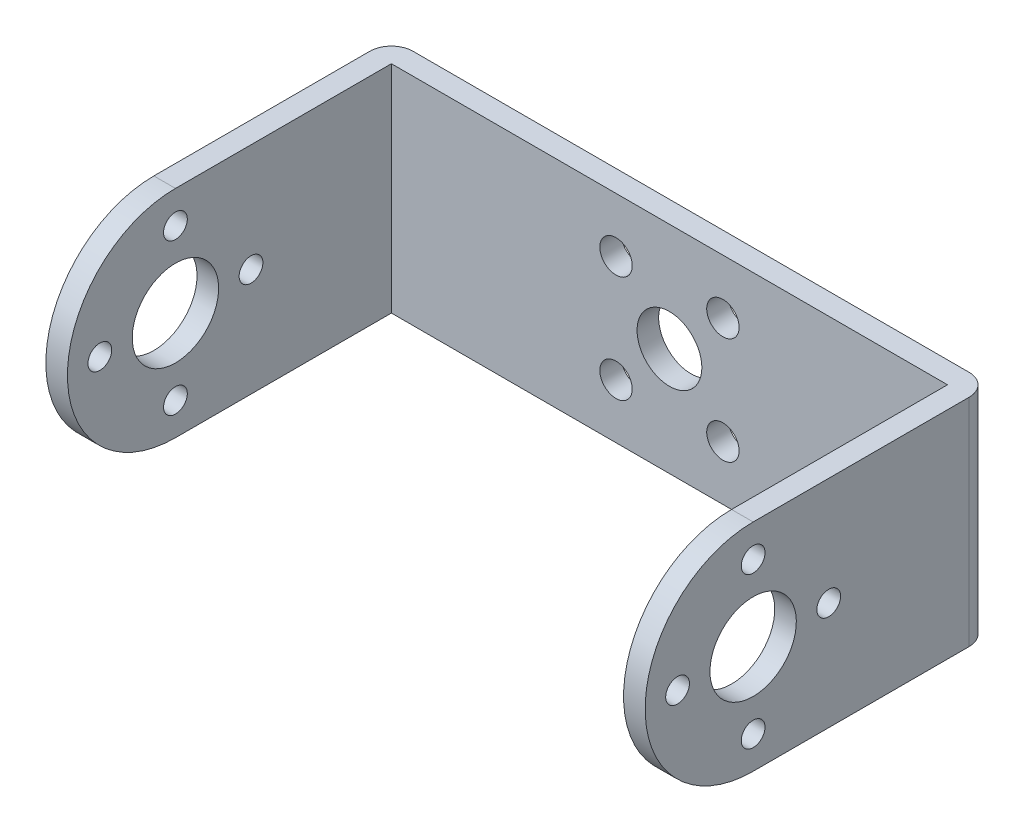
ISO-10303-21;
HEADER;
FILE_DESCRIPTION(('STEP AP214'),'2;1');
FILE_NAME('part.step','',(''),(''),'','','');
FILE_SCHEMA(('AUTOMOTIVE_DESIGN { 1 0 10303 214 1 1 1 1 }'));
ENDSEC;
DATA;
#1=APPLICATION_CONTEXT('core data for automotive mechanical design processes');
#2=APPLICATION_PROTOCOL_DEFINITION('international standard','automotive_design',2000,#1);
#3=PRODUCT_CONTEXT('',#1,'mechanical');
#4=PRODUCT('Part','Part','',(#3));
#5=PRODUCT_RELATED_PRODUCT_CATEGORY('part','',(#4));
#6=PRODUCT_DEFINITION_FORMATION('','',#4);
#7=PRODUCT_DEFINITION_CONTEXT('part definition',#1,'design');
#8=PRODUCT_DEFINITION('design','',#6,#7);
#9=PRODUCT_DEFINITION_SHAPE('','',#8);
#10=(LENGTH_UNIT() NAMED_UNIT(*) SI_UNIT(.MILLI.,.METRE.));
#11=(NAMED_UNIT(*) PLANE_ANGLE_UNIT() SI_UNIT($,.RADIAN.));
#12=(NAMED_UNIT(*) SI_UNIT($,.STERADIAN.) SOLID_ANGLE_UNIT());
#13=UNCERTAINTY_MEASURE_WITH_UNIT(LENGTH_MEASURE(1.E-05),#10,'distance_accuracy_value','');
#14=(GEOMETRIC_REPRESENTATION_CONTEXT(3) GLOBAL_UNCERTAINTY_ASSIGNED_CONTEXT((#13)) GLOBAL_UNIT_ASSIGNED_CONTEXT((#10,
#11,#12)) REPRESENTATION_CONTEXT('',''));
#15=CARTESIAN_POINT('',(0.,0.,0.));
#16=DIRECTION('',(0.,0.,1.));
#17=DIRECTION('',(1.,0.,0.));
#18=AXIS2_PLACEMENT_3D('',#15,#16,#17);
#19=CARTESIAN_POINT('',(0.,0.,2.));
#20=DIRECTION('',(0.,0.,1.));
#21=DIRECTION('',(1.,0.,0.));
#22=AXIS2_PLACEMENT_3D('',#19,#20,#21);
#23=PLANE('',#22);
#24=CARTESIAN_POINT('',(4.94974746830584,-4.94974746830583,2.));
#25=DIRECTION('',(0.,0.,1.));
#26=DIRECTION('',(1.,0.,0.));
#27=AXIS2_PLACEMENT_3D('',#24,#25,#26);
#28=CIRCLE('',#27,1.5);
#29=CARTESIAN_POINT('',(6.44974746830584,-4.94974746830583,2.));
#30=VERTEX_POINT('',#29);
#31=EDGE_CURVE('E278',#30,#30,#28,.T.);
#32=ORIENTED_EDGE('',*,*,#31,.F.);
#33=EDGE_LOOP('',(#32));
#34=FACE_BOUND('',#33,.T.);
#35=CARTESIAN_POINT('',(-4.94974746830583,4.94974746830583,2.));
#36=DIRECTION('',(0.,0.,1.));
#37=DIRECTION('',(1.,0.,0.));
#38=AXIS2_PLACEMENT_3D('',#35,#36,#37);
#39=CIRCLE('',#38,1.5);
#40=CARTESIAN_POINT('',(-3.44974746830583,4.94974746830583,2.));
#41=VERTEX_POINT('',#40);
#42=EDGE_CURVE('E290',#41,#41,#39,.T.);
#43=ORIENTED_EDGE('',*,*,#42,.F.);
#44=EDGE_LOOP('',(#43));
#45=FACE_BOUND('',#44,.T.);
#46=CARTESIAN_POINT('',(0.,0.,2.));
#47=DIRECTION('',(0.,0.,1.));
#48=DIRECTION('',(1.,0.,0.));
#49=AXIS2_PLACEMENT_3D('',#46,#47,#48);
#50=CIRCLE('',#49,3.);
#51=CARTESIAN_POINT('',(3.,0.,2.));
#52=VERTEX_POINT('',#51);
#53=EDGE_CURVE('E218',#52,#52,#50,.T.);
#54=ORIENTED_EDGE('',*,*,#53,.F.);
#55=EDGE_LOOP('',(#54));
#56=FACE_BOUND('',#55,.T.);
#57=CARTESIAN_POINT('',(4.94974746830583,4.94974746830583,2.));
#58=DIRECTION('',(0.,0.,1.));
#59=DIRECTION('',(1.,0.,0.));
#60=AXIS2_PLACEMENT_3D('',#57,#58,#59);
#61=CIRCLE('',#60,1.5);
#62=CARTESIAN_POINT('',(6.44974746830583,4.94974746830583,2.));
#63=VERTEX_POINT('',#62);
#64=EDGE_CURVE('E284',#63,#63,#61,.T.);
#65=ORIENTED_EDGE('',*,*,#64,.F.);
#66=EDGE_LOOP('',(#65));
#67=FACE_BOUND('',#66,.T.);
#68=CARTESIAN_POINT('',(-4.94974746830583,-4.94974746830584,2.));
#69=DIRECTION('',(0.,0.,1.));
#70=DIRECTION('',(1.,0.,0.));
#71=AXIS2_PLACEMENT_3D('',#68,#69,#70);
#72=CIRCLE('',#71,1.5);
#73=CARTESIAN_POINT('',(-3.44974746830583,-4.94974746830584,2.));
#74=VERTEX_POINT('',#73);
#75=EDGE_CURVE('E271',#74,#74,#72,.T.);
#76=ORIENTED_EDGE('',*,*,#75,.F.);
#77=EDGE_LOOP('',(#76));
#78=FACE_BOUND('',#77,.T.);
#79=DIRECTION('',(1.,0.,0.));
#80=VECTOR('',#79,1.);
#81=CARTESIAN_POINT('',(-27.75,-10.,2.));
#82=LINE('',#81,#80);
#83=CARTESIAN_POINT('',(-25.75,-10.,2.));
#84=VERTEX_POINT('',#83);
#85=CARTESIAN_POINT('',(25.75,-10.,2.));
#86=VERTEX_POINT('',#85);
#87=EDGE_CURVE('E195',#84,#86,#82,.T.);
#88=ORIENTED_EDGE('',*,*,#87,.T.);
#89=DIRECTION('',(0.,-1.,0.));
#90=VECTOR('',#89,1.);
#91=CARTESIAN_POINT('',(25.75,10.,2.));
#92=LINE('',#91,#90);
#93=CARTESIAN_POINT('',(25.75,10.,2.));
#94=VERTEX_POINT('',#93);
#95=EDGE_CURVE('E137',#94,#86,#92,.T.);
#96=ORIENTED_EDGE('',*,*,#95,.F.);
#97=DIRECTION('',(-1.,0.,0.));
#98=VECTOR('',#97,1.);
#99=CARTESIAN_POINT('',(-27.75,10.,2.));
#100=LINE('',#99,#98);
#101=CARTESIAN_POINT('',(-25.75,10.,2.));
#102=VERTEX_POINT('',#101);
#103=EDGE_CURVE('E142',#94,#102,#100,.T.);
#104=ORIENTED_EDGE('',*,*,#103,.T.);
#105=DIRECTION('',(0.,-1.,0.));
#106=VECTOR('',#105,1.);
#107=CARTESIAN_POINT('',(-25.75,10.,2.));
#108=LINE('',#107,#106);
#109=EDGE_CURVE('E189',#102,#84,#108,.T.);
#110=ORIENTED_EDGE('',*,*,#109,.T.);
#111=EDGE_LOOP('',(#88,#96,#104,#110));
#112=FACE_BOUND('',#111,.T.);
#113=ADVANCED_FACE('F36',(#34,#45,#56,#67,#78,#112),#23,.T.);
#114=CARTESIAN_POINT('',(0.,0.,0.));
#115=DIRECTION('',(0.,0.,1.));
#116=DIRECTION('',(1.,0.,0.));
#117=AXIS2_PLACEMENT_3D('',#114,#115,#116);
#118=PLANE('',#117);
#119=CARTESIAN_POINT('',(4.94974746830584,-4.94974746830583,0.));
#120=DIRECTION('',(0.,0.,1.));
#121=DIRECTION('',(1.,0.,0.));
#122=AXIS2_PLACEMENT_3D('',#119,#120,#121);
#123=CIRCLE('',#122,1.5);
#124=CARTESIAN_POINT('',(6.44974746830584,-4.94974746830583,0.));
#125=VERTEX_POINT('',#124);
#126=EDGE_CURVE('E276',#125,#125,#123,.T.);
#127=ORIENTED_EDGE('',*,*,#126,.T.);
#128=EDGE_LOOP('',(#127));
#129=FACE_BOUND('',#128,.T.);
#130=CARTESIAN_POINT('',(-4.94974746830583,4.94974746830583,0.));
#131=DIRECTION('',(0.,0.,1.));
#132=DIRECTION('',(1.,0.,0.));
#133=AXIS2_PLACEMENT_3D('',#130,#131,#132);
#134=CIRCLE('',#133,1.5);
#135=CARTESIAN_POINT('',(-3.44974746830583,4.94974746830583,0.));
#136=VERTEX_POINT('',#135);
#137=EDGE_CURVE('E287',#136,#136,#134,.T.);
#138=ORIENTED_EDGE('',*,*,#137,.T.);
#139=EDGE_LOOP('',(#138));
#140=FACE_BOUND('',#139,.T.);
#141=DIRECTION('',(1.,0.,0.));
#142=VECTOR('',#141,1.);
#143=CARTESIAN_POINT('',(-27.75,-10.,0.));
#144=LINE('',#143,#142);
#145=CARTESIAN_POINT('',(-25.75,-10.,0.));
#146=VERTEX_POINT('',#145);
#147=CARTESIAN_POINT('',(25.75,-10.,0.));
#148=VERTEX_POINT('',#147);
#149=EDGE_CURVE('E207',#146,#148,#144,.T.);
#150=ORIENTED_EDGE('',*,*,#149,.F.);
#151=DIRECTION('',(0.,-1.,0.));
#152=VECTOR('',#151,1.);
#153=CARTESIAN_POINT('',(-25.75,0.,0.));
#154=LINE('',#153,#152);
#155=CARTESIAN_POINT('',(-25.75,10.,0.));
#156=VERTEX_POINT('',#155);
#157=EDGE_CURVE('E58',#146,#156,#154,.F.);
#158=ORIENTED_EDGE('',*,*,#157,.T.);
#159=DIRECTION('',(-1.,0.,0.));
#160=VECTOR('',#159,1.);
#161=CARTESIAN_POINT('',(-27.75,10.,0.));
#162=LINE('',#161,#160);
#163=CARTESIAN_POINT('',(25.75,10.,0.));
#164=VERTEX_POINT('',#163);
#165=EDGE_CURVE('E216',#164,#156,#162,.T.);
#166=ORIENTED_EDGE('',*,*,#165,.F.);
#167=DIRECTION('',(0.,1.,0.));
#168=VECTOR('',#167,1.);
#169=CARTESIAN_POINT('',(25.75,0.,0.));
#170=LINE('',#169,#168);
#171=EDGE_CURVE('E237',#164,#148,#170,.F.);
#172=ORIENTED_EDGE('',*,*,#171,.T.);
#173=EDGE_LOOP('',(#150,#158,#166,#172));
#174=FACE_BOUND('',#173,.T.);
#175=CARTESIAN_POINT('',(0.,0.,0.));
#176=DIRECTION('',(0.,0.,1.));
#177=DIRECTION('',(1.,0.,0.));
#178=AXIS2_PLACEMENT_3D('',#175,#176,#177);
#179=CIRCLE('',#178,3.);
#180=CARTESIAN_POINT('',(3.,0.,0.));
#181=VERTEX_POINT('',#180);
#182=EDGE_CURVE('E212',#181,#181,#179,.T.);
#183=ORIENTED_EDGE('',*,*,#182,.T.);
#184=EDGE_LOOP('',(#183));
#185=FACE_BOUND('',#184,.T.);
#186=CARTESIAN_POINT('',(4.94974746830583,4.94974746830583,0.));
#187=DIRECTION('',(0.,0.,1.));
#188=DIRECTION('',(1.,0.,0.));
#189=AXIS2_PLACEMENT_3D('',#186,#187,#188);
#190=CIRCLE('',#189,1.5);
#191=CARTESIAN_POINT('',(6.44974746830583,4.94974746830583,0.));
#192=VERTEX_POINT('',#191);
#193=EDGE_CURVE('E281',#192,#192,#190,.T.);
#194=ORIENTED_EDGE('',*,*,#193,.T.);
#195=EDGE_LOOP('',(#194));
#196=FACE_BOUND('',#195,.T.);
#197=CARTESIAN_POINT('',(-4.94974746830583,-4.94974746830584,0.));
#198=DIRECTION('',(0.,0.,1.));
#199=DIRECTION('',(1.,0.,0.));
#200=AXIS2_PLACEMENT_3D('',#197,#198,#199);
#201=CIRCLE('',#200,1.5);
#202=CARTESIAN_POINT('',(-3.44974746830583,-4.94974746830584,0.));
#203=VERTEX_POINT('',#202);
#204=EDGE_CURVE('E267',#203,#203,#201,.T.);
#205=ORIENTED_EDGE('',*,*,#204,.T.);
#206=EDGE_LOOP('',(#205));
#207=FACE_BOUND('',#206,.T.);
#208=ADVANCED_FACE('F252',(#129,#140,#174,#185,#196,#207),#118,.F.);
#209=CARTESIAN_POINT('',(27.75,10.,2.));
#210=DIRECTION('',(-1.,0.,0.));
#211=DIRECTION('',(0.,0.,1.));
#212=AXIS2_PLACEMENT_3D('',#209,#210,#211);
#213=PLANE('',#212);
#214=DIRECTION('',(0.,0.,-1.));
#215=VECTOR('',#214,1.);
#216=CARTESIAN_POINT('',(27.75,-10.,2.));
#217=LINE('',#216,#215);
#218=CARTESIAN_POINT('',(27.75,-10.,22.));
#219=VERTEX_POINT('',#218);
#220=CARTESIAN_POINT('',(27.75,-10.,2.));
#221=VERTEX_POINT('',#220);
#222=EDGE_CURVE('E221',#219,#221,#217,.T.);
#223=ORIENTED_EDGE('',*,*,#222,.T.);
#224=DIRECTION('',(0.,1.,0.));
#225=VECTOR('',#224,1.);
#226=CARTESIAN_POINT('',(27.75,10.,2.));
#227=LINE('',#226,#225);
#228=CARTESIAN_POINT('',(27.75,10.,2.));
#229=VERTEX_POINT('',#228);
#230=EDGE_CURVE('E11',#221,#229,#227,.T.);
#231=ORIENTED_EDGE('',*,*,#230,.T.);
#232=DIRECTION('',(0.,0.,-1.));
#233=VECTOR('',#232,1.);
#234=CARTESIAN_POINT('',(27.75,10.,2.));
#235=LINE('',#234,#233);
#236=CARTESIAN_POINT('',(27.75,10.,22.));
#237=VERTEX_POINT('',#236);
#238=EDGE_CURVE('E229',#237,#229,#235,.T.);
#239=ORIENTED_EDGE('',*,*,#238,.F.);
#240=CARTESIAN_POINT('',(27.75,0.,22.));
#241=DIRECTION('',(-1.,0.,0.));
#242=DIRECTION('',(0.,-1.,0.));
#243=AXIS2_PLACEMENT_3D('',#240,#241,#242);
#244=CIRCLE('',#243,10.);
#245=EDGE_CURVE('E133',#219,#237,#244,.T.);
#246=ORIENTED_EDGE('',*,*,#245,.F.);
#247=EDGE_LOOP('',(#223,#231,#239,#246));
#248=FACE_BOUND('',#247,.T.);
#249=CARTESIAN_POINT('',(27.75,0.,14.9999999999999));
#250=DIRECTION('',(-1.,0.,0.));
#251=DIRECTION('',(0.,-1.,0.));
#252=AXIS2_PLACEMENT_3D('',#249,#250,#251);
#253=CIRCLE('',#252,1.1);
#254=CARTESIAN_POINT('',(27.75,-1.09999999999997,14.9999999999999));
#255=VERTEX_POINT('',#254);
#256=EDGE_CURVE('E633',#255,#255,#253,.T.);
#257=ORIENTED_EDGE('',*,*,#256,.T.);
#258=EDGE_LOOP('',(#257));
#259=FACE_BOUND('',#258,.T.);
#260=CARTESIAN_POINT('',(27.75,0.,28.9999999999999));
#261=DIRECTION('',(-1.,0.,0.));
#262=DIRECTION('',(0.,-1.,0.));
#263=AXIS2_PLACEMENT_3D('',#260,#261,#262);
#264=CIRCLE('',#263,1.1);
#265=CARTESIAN_POINT('',(27.75,-1.1,28.9999999999999));
#266=VERTEX_POINT('',#265);
#267=EDGE_CURVE('E615',#266,#266,#264,.T.);
#268=ORIENTED_EDGE('',*,*,#267,.T.);
#269=EDGE_LOOP('',(#268));
#270=FACE_BOUND('',#269,.T.);
#271=CARTESIAN_POINT('',(27.75,0.,22.));
#272=DIRECTION('',(-1.,0.,0.));
#273=DIRECTION('',(0.,-1.,0.));
#274=AXIS2_PLACEMENT_3D('',#271,#272,#273);
#275=CIRCLE('',#274,3.99999999999999);
#276=CARTESIAN_POINT('',(27.75,-3.99999999999999,22.));
#277=VERTEX_POINT('',#276);
#278=EDGE_CURVE('E147',#277,#277,#275,.T.);
#279=ORIENTED_EDGE('',*,*,#278,.T.);
#280=EDGE_LOOP('',(#279));
#281=FACE_BOUND('',#280,.T.);
#282=CARTESIAN_POINT('',(27.75,-6.99999999999998,21.9999999999999));
#283=DIRECTION('',(-1.,0.,0.));
#284=DIRECTION('',(0.,-1.,0.));
#285=AXIS2_PLACEMENT_3D('',#282,#283,#284);
#286=CIRCLE('',#285,1.1);
#287=CARTESIAN_POINT('',(27.75,-8.09999999999998,21.9999999999999));
#288=VERTEX_POINT('',#287);
#289=EDGE_CURVE('E622',#288,#288,#286,.T.);
#290=ORIENTED_EDGE('',*,*,#289,.T.);
#291=EDGE_LOOP('',(#290));
#292=FACE_BOUND('',#291,.T.);
#293=CARTESIAN_POINT('',(27.75,7.,22.));
#294=DIRECTION('',(-1.,0.,0.));
#295=DIRECTION('',(0.,-1.,0.));
#296=AXIS2_PLACEMENT_3D('',#293,#294,#295);
#297=CIRCLE('',#296,1.1);
#298=CARTESIAN_POINT('',(27.75,5.9,22.));
#299=VERTEX_POINT('',#298);
#300=EDGE_CURVE('E634',#299,#299,#297,.T.);
#301=ORIENTED_EDGE('',*,*,#300,.T.);
#302=EDGE_LOOP('',(#301));
#303=FACE_BOUND('',#302,.T.);
#304=ADVANCED_FACE('F255',(#248,#259,#270,#281,#292,#303),#213,.F.);
#305=CARTESIAN_POINT('',(-27.75,10.,2.));
#306=DIRECTION('',(0.,-1.,0.));
#307=DIRECTION('',(0.,0.,-1.));
#308=AXIS2_PLACEMENT_3D('',#305,#306,#307);
#309=PLANE('',#308);
#310=ORIENTED_EDGE('',*,*,#165,.T.);
#311=CARTESIAN_POINT('',(-25.75,10.,2.));
#312=DIRECTION('',(0.,-1.,0.));
#313=DIRECTION('',(0.,0.,-1.));
#314=AXIS2_PLACEMENT_3D('',#311,#312,#313);
#315=CIRCLE('',#314,2.);
#316=CARTESIAN_POINT('',(-27.75,10.,2.));
#317=VERTEX_POINT('',#316);
#318=EDGE_CURVE('E44',#156,#317,#315,.F.);
#319=ORIENTED_EDGE('',*,*,#318,.T.);
#320=DIRECTION('',(0.,0.,-1.));
#321=VECTOR('',#320,1.);
#322=CARTESIAN_POINT('',(-27.75,10.,2.));
#323=LINE('',#322,#321);
#324=CARTESIAN_POINT('',(-27.75,10.,22.));
#325=VERTEX_POINT('',#324);
#326=EDGE_CURVE('E227',#325,#317,#323,.T.);
#327=ORIENTED_EDGE('',*,*,#326,.F.);
#328=DIRECTION('',(-1.,0.,0.));
#329=VECTOR('',#328,1.);
#330=CARTESIAN_POINT('',(-25.75,10.,22.));
#331=LINE('',#330,#329);
#332=CARTESIAN_POINT('',(-25.75,10.,22.));
#333=VERTEX_POINT('',#332);
#334=EDGE_CURVE('E265',#333,#325,#331,.T.);
#335=ORIENTED_EDGE('',*,*,#334,.F.);
#336=DIRECTION('',(0.,0.,-1.));
#337=VECTOR('',#336,1.);
#338=CARTESIAN_POINT('',(-25.75,10.,2.));
#339=LINE('',#338,#337);
#340=EDGE_CURVE('E194',#333,#102,#339,.T.);
#341=ORIENTED_EDGE('',*,*,#340,.T.);
#342=ORIENTED_EDGE('',*,*,#103,.F.);
#343=DIRECTION('',(0.,0.,-1.));
#344=VECTOR('',#343,1.);
#345=CARTESIAN_POINT('',(25.75,10.,2.));
#346=LINE('',#345,#344);
#347=CARTESIAN_POINT('',(25.75,10.,22.));
#348=VERTEX_POINT('',#347);
#349=EDGE_CURVE('E121',#348,#94,#346,.T.);
#350=ORIENTED_EDGE('',*,*,#349,.F.);
#351=DIRECTION('',(1.,0.,0.));
#352=VECTOR('',#351,1.);
#353=CARTESIAN_POINT('',(25.75,10.,22.));
#354=LINE('',#353,#352);
#355=EDGE_CURVE('E130',#348,#237,#354,.T.);
#356=ORIENTED_EDGE('',*,*,#355,.T.);
#357=ORIENTED_EDGE('',*,*,#238,.T.);
#358=CARTESIAN_POINT('',(25.75,10.,2.));
#359=DIRECTION('',(0.,-1.,0.));
#360=DIRECTION('',(0.,0.,-1.));
#361=AXIS2_PLACEMENT_3D('',#358,#359,#360);
#362=CIRCLE('',#361,2.);
#363=EDGE_CURVE('E51',#229,#164,#362,.F.);
#364=ORIENTED_EDGE('',*,*,#363,.T.);
#365=EDGE_LOOP('',(#310,#319,#327,#335,#341,#342,#350,#356,#357,#364));
#366=FACE_BOUND('',#365,.T.);
#367=ADVANCED_FACE('F140',(#366),#309,.F.);
#368=CARTESIAN_POINT('',(-27.75,10.,2.));
#369=DIRECTION('',(1.,0.,0.));
#370=DIRECTION('',(0.,0.,-1.));
#371=AXIS2_PLACEMENT_3D('',#368,#369,#370);
#372=PLANE('',#371);
#373=ORIENTED_EDGE('',*,*,#326,.T.);
#374=DIRECTION('',(0.,-1.,0.));
#375=VECTOR('',#374,1.);
#376=CARTESIAN_POINT('',(-27.75,10.,2.));
#377=LINE('',#376,#375);
#378=CARTESIAN_POINT('',(-27.75,-10.,2.));
#379=VERTEX_POINT('',#378);
#380=EDGE_CURVE('E208',#317,#379,#377,.T.);
#381=ORIENTED_EDGE('',*,*,#380,.T.);
#382=DIRECTION('',(0.,0.,-1.));
#383=VECTOR('',#382,1.);
#384=CARTESIAN_POINT('',(-27.75,-10.,2.));
#385=LINE('',#384,#383);
#386=CARTESIAN_POINT('',(-27.75,-10.,22.));
#387=VERTEX_POINT('',#386);
#388=EDGE_CURVE('E224',#387,#379,#385,.T.);
#389=ORIENTED_EDGE('',*,*,#388,.F.);
#390=CARTESIAN_POINT('',(-27.75,0.,22.));
#391=DIRECTION('',(-1.,0.,0.));
#392=DIRECTION('',(0.,-1.,0.));
#393=AXIS2_PLACEMENT_3D('',#390,#391,#392);
#394=CIRCLE('',#393,10.);
#395=EDGE_CURVE('E181',#387,#325,#394,.T.);
#396=ORIENTED_EDGE('',*,*,#395,.T.);
#397=EDGE_LOOP('',(#373,#381,#389,#396));
#398=FACE_BOUND('',#397,.T.);
#399=CARTESIAN_POINT('',(-27.75,7.,22.));
#400=DIRECTION('',(-1.,0.,0.));
#401=DIRECTION('',(0.,-1.,0.));
#402=AXIS2_PLACEMENT_3D('',#399,#400,#401);
#403=CIRCLE('',#402,1.1);
#404=CARTESIAN_POINT('',(-27.75,5.9,22.));
#405=VERTEX_POINT('',#404);
#406=EDGE_CURVE('E152',#405,#405,#403,.T.);
#407=ORIENTED_EDGE('',*,*,#406,.F.);
#408=EDGE_LOOP('',(#407));
#409=FACE_BOUND('',#408,.T.);
#410=CARTESIAN_POINT('',(-27.75,0.,14.9999999999999));
#411=DIRECTION('',(-1.,0.,0.));
#412=DIRECTION('',(0.,-1.,0.));
#413=AXIS2_PLACEMENT_3D('',#410,#411,#412);
#414=CIRCLE('',#413,1.1);
#415=CARTESIAN_POINT('',(-27.75,-1.09999999999997,14.9999999999999));
#416=VERTEX_POINT('',#415);
#417=EDGE_CURVE('E157',#416,#416,#414,.T.);
#418=ORIENTED_EDGE('',*,*,#417,.F.);
#419=EDGE_LOOP('',(#418));
#420=FACE_BOUND('',#419,.T.);
#421=CARTESIAN_POINT('',(-27.75,-6.99999999999998,21.9999999999999));
#422=DIRECTION('',(-1.,0.,0.));
#423=DIRECTION('',(0.,-1.,0.));
#424=AXIS2_PLACEMENT_3D('',#421,#422,#423);
#425=CIRCLE('',#424,1.1);
#426=CARTESIAN_POINT('',(-27.75,-8.09999999999998,21.9999999999999));
#427=VERTEX_POINT('',#426);
#428=EDGE_CURVE('E163',#427,#427,#425,.T.);
#429=ORIENTED_EDGE('',*,*,#428,.F.);
#430=EDGE_LOOP('',(#429));
#431=FACE_BOUND('',#430,.T.);
#432=CARTESIAN_POINT('',(-27.75,0.,28.9999999999999));
#433=DIRECTION('',(-1.,0.,0.));
#434=DIRECTION('',(0.,-1.,0.));
#435=AXIS2_PLACEMENT_3D('',#432,#433,#434);
#436=CIRCLE('',#435,1.1);
#437=CARTESIAN_POINT('',(-27.75,-1.1,28.9999999999999));
#438=VERTEX_POINT('',#437);
#439=EDGE_CURVE('E169',#438,#438,#436,.T.);
#440=ORIENTED_EDGE('',*,*,#439,.F.);
#441=EDGE_LOOP('',(#440));
#442=FACE_BOUND('',#441,.T.);
#443=CARTESIAN_POINT('',(-27.75,0.,22.));
#444=DIRECTION('',(-1.,0.,0.));
#445=DIRECTION('',(0.,-1.,0.));
#446=AXIS2_PLACEMENT_3D('',#443,#444,#445);
#447=CIRCLE('',#446,3.99999999999999);
#448=CARTESIAN_POINT('',(-27.75,-3.99999999999999,22.));
#449=VERTEX_POINT('',#448);
#450=EDGE_CURVE('E175',#449,#449,#447,.T.);
#451=ORIENTED_EDGE('',*,*,#450,.F.);
#452=EDGE_LOOP('',(#451));
#453=FACE_BOUND('',#452,.T.);
#454=ADVANCED_FACE('F246',(#398,#409,#420,#431,#442,#453),#372,.F.);
#455=CARTESIAN_POINT('',(-27.75,-10.,2.));
#456=DIRECTION('',(0.,1.,0.));
#457=DIRECTION('',(0.,0.,1.));
#458=AXIS2_PLACEMENT_3D('',#455,#456,#457);
#459=PLANE('',#458);
#460=ORIENTED_EDGE('',*,*,#388,.T.);
#461=CARTESIAN_POINT('',(-25.75,-10.,2.));
#462=DIRECTION('',(0.,1.,0.));
#463=DIRECTION('',(0.,0.,1.));
#464=AXIS2_PLACEMENT_3D('',#461,#462,#463);
#465=CIRCLE('',#464,2.);
#466=EDGE_CURVE('E234',#379,#146,#465,.F.);
#467=ORIENTED_EDGE('',*,*,#466,.T.);
#468=ORIENTED_EDGE('',*,*,#149,.T.);
#469=CARTESIAN_POINT('',(25.75,-10.,2.));
#470=DIRECTION('',(0.,1.,0.));
#471=DIRECTION('',(0.,0.,1.));
#472=AXIS2_PLACEMENT_3D('',#469,#470,#471);
#473=CIRCLE('',#472,2.);
#474=EDGE_CURVE('E231',#148,#221,#473,.F.);
#475=ORIENTED_EDGE('',*,*,#474,.T.);
#476=ORIENTED_EDGE('',*,*,#222,.F.);
#477=DIRECTION('',(1.,0.,0.));
#478=VECTOR('',#477,1.);
#479=CARTESIAN_POINT('',(25.75,-10.,22.));
#480=LINE('',#479,#478);
#481=CARTESIAN_POINT('',(25.75,-10.,22.));
#482=VERTEX_POINT('',#481);
#483=EDGE_CURVE('E136',#482,#219,#480,.T.);
#484=ORIENTED_EDGE('',*,*,#483,.F.);
#485=DIRECTION('',(0.,0.,1.));
#486=VECTOR('',#485,1.);
#487=CARTESIAN_POINT('',(25.75,-10.,22.));
#488=LINE('',#487,#486);
#489=EDGE_CURVE('E123',#86,#482,#488,.T.);
#490=ORIENTED_EDGE('',*,*,#489,.F.);
#491=ORIENTED_EDGE('',*,*,#87,.F.);
#492=DIRECTION('',(0.,0.,1.));
#493=VECTOR('',#492,1.);
#494=CARTESIAN_POINT('',(-25.75,-10.,22.));
#495=LINE('',#494,#493);
#496=CARTESIAN_POINT('',(-25.75,-10.,22.));
#497=VERTEX_POINT('',#496);
#498=EDGE_CURVE('E193',#84,#497,#495,.T.);
#499=ORIENTED_EDGE('',*,*,#498,.T.);
#500=DIRECTION('',(-1.,0.,0.));
#501=VECTOR('',#500,1.);
#502=CARTESIAN_POINT('',(-25.75,-10.,22.));
#503=LINE('',#502,#501);
#504=EDGE_CURVE('E268',#497,#387,#503,.T.);
#505=ORIENTED_EDGE('',*,*,#504,.T.);
#506=EDGE_LOOP('',(#460,#467,#468,#475,#476,#484,#490,#491,#499,#505));
#507=FACE_BOUND('',#506,.T.);
#508=ADVANCED_FACE('F250',(#507),#459,.F.);
#509=CARTESIAN_POINT('',(0.,0.,2.));
#510=DIRECTION('',(0.,0.,-1.));
#511=DIRECTION('',(-1.,0.,0.));
#512=AXIS2_PLACEMENT_3D('',#509,#510,#511);
#513=CYLINDRICAL_SURFACE('',#512,3.);
#514=ORIENTED_EDGE('',*,*,#53,.T.);
#515=EDGE_LOOP('',(#514));
#516=FACE_BOUND('',#515,.T.);
#517=ORIENTED_EDGE('',*,*,#182,.F.);
#518=EDGE_LOOP('',(#517));
#519=FACE_BOUND('',#518,.T.);
#520=ADVANCED_FACE('F301',(#516,#519),#513,.F.);
#521=CARTESIAN_POINT('',(-4.94974746830583,4.94974746830583,2.));
#522=DIRECTION('',(0.,0.,-1.));
#523=DIRECTION('',(-1.,0.,0.));
#524=AXIS2_PLACEMENT_3D('',#521,#522,#523);
#525=CYLINDRICAL_SURFACE('',#524,1.5);
#526=ORIENTED_EDGE('',*,*,#42,.T.);
#527=EDGE_LOOP('',(#526));
#528=FACE_BOUND('',#527,.T.);
#529=ORIENTED_EDGE('',*,*,#137,.F.);
#530=EDGE_LOOP('',(#529));
#531=FACE_BOUND('',#530,.T.);
#532=ADVANCED_FACE('F303',(#528,#531),#525,.F.);
#533=CARTESIAN_POINT('',(4.94974746830583,4.94974746830583,2.));
#534=DIRECTION('',(0.,0.,-1.));
#535=DIRECTION('',(-1.,0.,0.));
#536=AXIS2_PLACEMENT_3D('',#533,#534,#535);
#537=CYLINDRICAL_SURFACE('',#536,1.5);
#538=ORIENTED_EDGE('',*,*,#64,.T.);
#539=EDGE_LOOP('',(#538));
#540=FACE_BOUND('',#539,.T.);
#541=ORIENTED_EDGE('',*,*,#193,.F.);
#542=EDGE_LOOP('',(#541));
#543=FACE_BOUND('',#542,.T.);
#544=ADVANCED_FACE('F309',(#540,#543),#537,.F.);
#545=CARTESIAN_POINT('',(4.94974746830584,-4.94974746830583,2.));
#546=DIRECTION('',(0.,0.,-1.));
#547=DIRECTION('',(-1.,0.,0.));
#548=AXIS2_PLACEMENT_3D('',#545,#546,#547);
#549=CYLINDRICAL_SURFACE('',#548,1.5);
#550=ORIENTED_EDGE('',*,*,#31,.T.);
#551=EDGE_LOOP('',(#550));
#552=FACE_BOUND('',#551,.T.);
#553=ORIENTED_EDGE('',*,*,#126,.F.);
#554=EDGE_LOOP('',(#553));
#555=FACE_BOUND('',#554,.T.);
#556=ADVANCED_FACE('F392',(#552,#555),#549,.F.);
#557=CARTESIAN_POINT('',(-4.94974746830583,-4.94974746830584,2.));
#558=DIRECTION('',(0.,0.,-1.));
#559=DIRECTION('',(-1.,0.,0.));
#560=AXIS2_PLACEMENT_3D('',#557,#558,#559);
#561=CYLINDRICAL_SURFACE('',#560,1.5);
#562=ORIENTED_EDGE('',*,*,#75,.T.);
#563=EDGE_LOOP('',(#562));
#564=FACE_BOUND('',#563,.T.);
#565=ORIENTED_EDGE('',*,*,#204,.F.);
#566=EDGE_LOOP('',(#565));
#567=FACE_BOUND('',#566,.T.);
#568=ADVANCED_FACE('F389',(#564,#567),#561,.F.);
#569=CARTESIAN_POINT('',(-25.75,0.,22.));
#570=DIRECTION('',(-1.,0.,0.));
#571=DIRECTION('',(0.,-1.,0.));
#572=AXIS2_PLACEMENT_3D('',#569,#570,#571);
#573=CYLINDRICAL_SURFACE('',#572,10.);
#574=ORIENTED_EDGE('',*,*,#395,.F.);
#575=ORIENTED_EDGE('',*,*,#504,.F.);
#576=CARTESIAN_POINT('',(-25.75,0.,22.));
#577=DIRECTION('',(-1.,0.,0.));
#578=DIRECTION('',(0.,-1.,0.));
#579=AXIS2_PLACEMENT_3D('',#576,#577,#578);
#580=CIRCLE('',#579,10.);
#581=EDGE_CURVE('E186',#497,#333,#580,.T.);
#582=ORIENTED_EDGE('',*,*,#581,.T.);
#583=ORIENTED_EDGE('',*,*,#334,.T.);
#584=EDGE_LOOP('',(#574,#575,#582,#583));
#585=FACE_BOUND('',#584,.T.);
#586=ADVANCED_FACE('F385',(#585),#573,.T.);
#587=CARTESIAN_POINT('',(-25.75,0.,22.));
#588=DIRECTION('',(-1.,0.,0.));
#589=DIRECTION('',(0.,-1.,0.));
#590=AXIS2_PLACEMENT_3D('',#587,#588,#589);
#591=PLANE('',#590);
#592=CARTESIAN_POINT('',(-25.75,7.,22.));
#593=DIRECTION('',(-1.,0.,0.));
#594=DIRECTION('',(0.,-1.,0.));
#595=AXIS2_PLACEMENT_3D('',#592,#593,#594);
#596=CIRCLE('',#595,1.1);
#597=CARTESIAN_POINT('',(-25.75,5.9,22.));
#598=VERTEX_POINT('',#597);
#599=EDGE_CURVE('E154',#598,#598,#596,.T.);
#600=ORIENTED_EDGE('',*,*,#599,.T.);
#601=EDGE_LOOP('',(#600));
#602=FACE_BOUND('',#601,.T.);
#603=CARTESIAN_POINT('',(-25.75,0.,14.9999999999999));
#604=DIRECTION('',(-1.,0.,0.));
#605=DIRECTION('',(0.,-1.,0.));
#606=AXIS2_PLACEMENT_3D('',#603,#604,#605);
#607=CIRCLE('',#606,1.1);
#608=CARTESIAN_POINT('',(-25.75,-1.09999999999997,14.9999999999999));
#609=VERTEX_POINT('',#608);
#610=EDGE_CURVE('E160',#609,#609,#607,.T.);
#611=ORIENTED_EDGE('',*,*,#610,.T.);
#612=EDGE_LOOP('',(#611));
#613=FACE_BOUND('',#612,.T.);
#614=CARTESIAN_POINT('',(-25.75,-6.99999999999998,21.9999999999999));
#615=DIRECTION('',(-1.,0.,0.));
#616=DIRECTION('',(0.,-1.,0.));
#617=AXIS2_PLACEMENT_3D('',#614,#615,#616);
#618=CIRCLE('',#617,1.1);
#619=CARTESIAN_POINT('',(-25.75,-8.09999999999998,21.9999999999999));
#620=VERTEX_POINT('',#619);
#621=EDGE_CURVE('E166',#620,#620,#618,.T.);
#622=ORIENTED_EDGE('',*,*,#621,.T.);
#623=EDGE_LOOP('',(#622));
#624=FACE_BOUND('',#623,.T.);
#625=CARTESIAN_POINT('',(-25.75,0.,28.9999999999999));
#626=DIRECTION('',(-1.,0.,0.));
#627=DIRECTION('',(0.,-1.,0.));
#628=AXIS2_PLACEMENT_3D('',#625,#626,#627);
#629=CIRCLE('',#628,1.1);
#630=CARTESIAN_POINT('',(-25.75,-1.1,28.9999999999999));
#631=VERTEX_POINT('',#630);
#632=EDGE_CURVE('E172',#631,#631,#629,.T.);
#633=ORIENTED_EDGE('',*,*,#632,.T.);
#634=EDGE_LOOP('',(#633));
#635=FACE_BOUND('',#634,.T.);
#636=CARTESIAN_POINT('',(-25.75,0.,22.));
#637=DIRECTION('',(-1.,0.,0.));
#638=DIRECTION('',(0.,-1.,0.));
#639=AXIS2_PLACEMENT_3D('',#636,#637,#638);
#640=CIRCLE('',#639,3.99999999999999);
#641=CARTESIAN_POINT('',(-25.75,-3.99999999999999,22.));
#642=VERTEX_POINT('',#641);
#643=EDGE_CURVE('E178',#642,#642,#640,.T.);
#644=ORIENTED_EDGE('',*,*,#643,.T.);
#645=EDGE_LOOP('',(#644));
#646=FACE_BOUND('',#645,.T.);
#647=ORIENTED_EDGE('',*,*,#340,.F.);
#648=ORIENTED_EDGE('',*,*,#581,.F.);
#649=ORIENTED_EDGE('',*,*,#498,.F.);
#650=ORIENTED_EDGE('',*,*,#109,.F.);
#651=EDGE_LOOP('',(#647,#648,#649,#650));
#652=FACE_BOUND('',#651,.T.);
#653=ADVANCED_FACE('F263',(#602,#613,#624,#635,#646,#652),#591,.F.);
#654=CARTESIAN_POINT('',(-25.75,0.,22.));
#655=DIRECTION('',(-1.,0.,0.));
#656=DIRECTION('',(0.,-1.,0.));
#657=AXIS2_PLACEMENT_3D('',#654,#655,#656);
#658=CYLINDRICAL_SURFACE('',#657,3.99999999999999);
#659=ORIENTED_EDGE('',*,*,#643,.F.);
#660=EDGE_LOOP('',(#659));
#661=FACE_BOUND('',#660,.T.);
#662=ORIENTED_EDGE('',*,*,#450,.T.);
#663=EDGE_LOOP('',(#662));
#664=FACE_BOUND('',#663,.T.);
#665=ADVANCED_FACE('F378',(#661,#664),#658,.F.);
#666=CARTESIAN_POINT('',(-25.75,0.,28.9999999999999));
#667=DIRECTION('',(-1.,0.,0.));
#668=DIRECTION('',(0.,-1.,0.));
#669=AXIS2_PLACEMENT_3D('',#666,#667,#668);
#670=CYLINDRICAL_SURFACE('',#669,1.1);
#671=ORIENTED_EDGE('',*,*,#632,.F.);
#672=EDGE_LOOP('',(#671));
#673=FACE_BOUND('',#672,.T.);
#674=ORIENTED_EDGE('',*,*,#439,.T.);
#675=EDGE_LOOP('',(#674));
#676=FACE_BOUND('',#675,.T.);
#677=ADVANCED_FACE('F374',(#673,#676),#670,.F.);
#678=CARTESIAN_POINT('',(-25.75,-6.99999999999998,21.9999999999999));
#679=DIRECTION('',(-1.,0.,0.));
#680=DIRECTION('',(0.,-1.,0.));
#681=AXIS2_PLACEMENT_3D('',#678,#679,#680);
#682=CYLINDRICAL_SURFACE('',#681,1.1);
#683=ORIENTED_EDGE('',*,*,#621,.F.);
#684=EDGE_LOOP('',(#683));
#685=FACE_BOUND('',#684,.T.);
#686=ORIENTED_EDGE('',*,*,#428,.T.);
#687=EDGE_LOOP('',(#686));
#688=FACE_BOUND('',#687,.T.);
#689=ADVANCED_FACE('F370',(#685,#688),#682,.F.);
#690=CARTESIAN_POINT('',(-25.75,0.,14.9999999999999));
#691=DIRECTION('',(-1.,0.,0.));
#692=DIRECTION('',(0.,-1.,0.));
#693=AXIS2_PLACEMENT_3D('',#690,#691,#692);
#694=CYLINDRICAL_SURFACE('',#693,1.1);
#695=ORIENTED_EDGE('',*,*,#610,.F.);
#696=EDGE_LOOP('',(#695));
#697=FACE_BOUND('',#696,.T.);
#698=ORIENTED_EDGE('',*,*,#417,.T.);
#699=EDGE_LOOP('',(#698));
#700=FACE_BOUND('',#699,.T.);
#701=ADVANCED_FACE('F366',(#697,#700),#694,.F.);
#702=CARTESIAN_POINT('',(-25.75,7.,22.));
#703=DIRECTION('',(-1.,0.,0.));
#704=DIRECTION('',(0.,-1.,0.));
#705=AXIS2_PLACEMENT_3D('',#702,#703,#704);
#706=CYLINDRICAL_SURFACE('',#705,1.1);
#707=ORIENTED_EDGE('',*,*,#599,.F.);
#708=EDGE_LOOP('',(#707));
#709=FACE_BOUND('',#708,.T.);
#710=ORIENTED_EDGE('',*,*,#406,.T.);
#711=EDGE_LOOP('',(#710));
#712=FACE_BOUND('',#711,.T.);
#713=ADVANCED_FACE('F360',(#709,#712),#706,.F.);
#714=CARTESIAN_POINT('',(25.75,0.,22.));
#715=DIRECTION('',(1.,0.,0.));
#716=DIRECTION('',(0.,-1.,0.));
#717=AXIS2_PLACEMENT_3D('',#714,#715,#716);
#718=PLANE('',#717);
#719=CARTESIAN_POINT('',(25.75,0.,14.9999999999999));
#720=DIRECTION('',(-1.,0.,0.));
#721=DIRECTION('',(0.,-1.,0.));
#722=AXIS2_PLACEMENT_3D('',#719,#720,#721);
#723=CIRCLE('',#722,1.1);
#724=CARTESIAN_POINT('',(25.75,-1.09999999999997,14.9999999999999));
#725=VERTEX_POINT('',#724);
#726=EDGE_CURVE('E611',#725,#725,#723,.T.);
#727=ORIENTED_EDGE('',*,*,#726,.F.);
#728=EDGE_LOOP('',(#727));
#729=FACE_BOUND('',#728,.T.);
#730=CARTESIAN_POINT('',(25.75,0.,28.9999999999999));
#731=DIRECTION('',(-1.,0.,0.));
#732=DIRECTION('',(0.,-1.,0.));
#733=AXIS2_PLACEMENT_3D('',#730,#731,#732);
#734=CIRCLE('',#733,1.1);
#735=CARTESIAN_POINT('',(25.75,-1.1,28.9999999999999));
#736=VERTEX_POINT('',#735);
#737=EDGE_CURVE('E614',#736,#736,#734,.T.);
#738=ORIENTED_EDGE('',*,*,#737,.F.);
#739=EDGE_LOOP('',(#738));
#740=FACE_BOUND('',#739,.T.);
#741=ORIENTED_EDGE('',*,*,#349,.T.);
#742=ORIENTED_EDGE('',*,*,#95,.T.);
#743=ORIENTED_EDGE('',*,*,#489,.T.);
#744=CARTESIAN_POINT('',(25.75,0.,22.));
#745=DIRECTION('',(-1.,0.,0.));
#746=DIRECTION('',(0.,-1.,0.));
#747=AXIS2_PLACEMENT_3D('',#744,#745,#746);
#748=CIRCLE('',#747,10.);
#749=EDGE_CURVE('E115',#482,#348,#748,.T.);
#750=ORIENTED_EDGE('',*,*,#749,.T.);
#751=EDGE_LOOP('',(#741,#742,#743,#750));
#752=FACE_BOUND('',#751,.T.);
#753=CARTESIAN_POINT('',(25.75,0.,22.));
#754=DIRECTION('',(-1.,0.,0.));
#755=DIRECTION('',(0.,-1.,0.));
#756=AXIS2_PLACEMENT_3D('',#753,#754,#755);
#757=CIRCLE('',#756,3.99999999999999);
#758=CARTESIAN_POINT('',(25.75,-3.99999999999999,22.));
#759=VERTEX_POINT('',#758);
#760=EDGE_CURVE('E144',#759,#759,#757,.T.);
#761=ORIENTED_EDGE('',*,*,#760,.F.);
#762=EDGE_LOOP('',(#761));
#763=FACE_BOUND('',#762,.T.);
#764=CARTESIAN_POINT('',(25.75,-6.99999999999998,21.9999999999999));
#765=DIRECTION('',(-1.,0.,0.));
#766=DIRECTION('',(0.,-1.,0.));
#767=AXIS2_PLACEMENT_3D('',#764,#765,#766);
#768=CIRCLE('',#767,1.1);
#769=CARTESIAN_POINT('',(25.75,-8.09999999999998,21.9999999999999));
#770=VERTEX_POINT('',#769);
#771=EDGE_CURVE('E619',#770,#770,#768,.T.);
#772=ORIENTED_EDGE('',*,*,#771,.F.);
#773=EDGE_LOOP('',(#772));
#774=FACE_BOUND('',#773,.T.);
#775=CARTESIAN_POINT('',(25.75,7.,22.));
#776=DIRECTION('',(-1.,0.,0.));
#777=DIRECTION('',(0.,-1.,0.));
#778=AXIS2_PLACEMENT_3D('',#775,#776,#777);
#779=CIRCLE('',#778,1.1);
#780=CARTESIAN_POINT('',(25.75,5.9,22.));
#781=VERTEX_POINT('',#780);
#782=EDGE_CURVE('E632',#781,#781,#779,.T.);
#783=ORIENTED_EDGE('',*,*,#782,.F.);
#784=EDGE_LOOP('',(#783));
#785=FACE_BOUND('',#784,.T.);
#786=ADVANCED_FACE('F117',(#729,#740,#752,#763,#774,#785),#718,.F.);
#787=CARTESIAN_POINT('',(25.75,0.,22.));
#788=DIRECTION('',(1.,0.,0.));
#789=DIRECTION('',(0.,1.,0.));
#790=AXIS2_PLACEMENT_3D('',#787,#788,#789);
#791=CYLINDRICAL_SURFACE('',#790,10.);
#792=ORIENTED_EDGE('',*,*,#245,.T.);
#793=ORIENTED_EDGE('',*,*,#355,.F.);
#794=ORIENTED_EDGE('',*,*,#749,.F.);
#795=ORIENTED_EDGE('',*,*,#483,.T.);
#796=EDGE_LOOP('',(#792,#793,#794,#795));
#797=FACE_BOUND('',#796,.T.);
#798=ADVANCED_FACE('F131',(#797),#791,.T.);
#799=CARTESIAN_POINT('',(25.75,0.,22.));
#800=DIRECTION('',(1.,0.,0.));
#801=DIRECTION('',(0.,1.,0.));
#802=AXIS2_PLACEMENT_3D('',#799,#800,#801);
#803=CYLINDRICAL_SURFACE('',#802,3.99999999999999);
#804=ORIENTED_EDGE('',*,*,#760,.T.);
#805=EDGE_LOOP('',(#804));
#806=FACE_BOUND('',#805,.T.);
#807=ORIENTED_EDGE('',*,*,#278,.F.);
#808=EDGE_LOOP('',(#807));
#809=FACE_BOUND('',#808,.T.);
#810=ADVANCED_FACE('F353',(#806,#809),#803,.F.);
#811=CARTESIAN_POINT('',(25.75,0.,28.9999999999999));
#812=DIRECTION('',(1.,0.,0.));
#813=DIRECTION('',(0.,1.,0.));
#814=AXIS2_PLACEMENT_3D('',#811,#812,#813);
#815=CYLINDRICAL_SURFACE('',#814,1.1);
#816=ORIENTED_EDGE('',*,*,#737,.T.);
#817=EDGE_LOOP('',(#816));
#818=FACE_BOUND('',#817,.T.);
#819=ORIENTED_EDGE('',*,*,#267,.F.);
#820=EDGE_LOOP('',(#819));
#821=FACE_BOUND('',#820,.T.);
#822=ADVANCED_FACE('F349',(#818,#821),#815,.F.);
#823=CARTESIAN_POINT('',(25.75,-6.99999999999998,21.9999999999999));
#824=DIRECTION('',(1.,0.,0.));
#825=DIRECTION('',(0.,1.,0.));
#826=AXIS2_PLACEMENT_3D('',#823,#824,#825);
#827=CYLINDRICAL_SURFACE('',#826,1.1);
#828=ORIENTED_EDGE('',*,*,#771,.T.);
#829=EDGE_LOOP('',(#828));
#830=FACE_BOUND('',#829,.T.);
#831=ORIENTED_EDGE('',*,*,#289,.F.);
#832=EDGE_LOOP('',(#831));
#833=FACE_BOUND('',#832,.T.);
#834=ADVANCED_FACE('F341',(#830,#833),#827,.F.);
#835=CARTESIAN_POINT('',(25.75,0.,14.9999999999999));
#836=DIRECTION('',(1.,0.,0.));
#837=DIRECTION('',(0.,1.,0.));
#838=AXIS2_PLACEMENT_3D('',#835,#836,#837);
#839=CYLINDRICAL_SURFACE('',#838,1.1);
#840=ORIENTED_EDGE('',*,*,#726,.T.);
#841=EDGE_LOOP('',(#840));
#842=FACE_BOUND('',#841,.T.);
#843=ORIENTED_EDGE('',*,*,#256,.F.);
#844=EDGE_LOOP('',(#843));
#845=FACE_BOUND('',#844,.T.);
#846=ADVANCED_FACE('F335',(#842,#845),#839,.F.);
#847=CARTESIAN_POINT('',(25.75,7.,22.));
#848=DIRECTION('',(1.,0.,0.));
#849=DIRECTION('',(0.,1.,0.));
#850=AXIS2_PLACEMENT_3D('',#847,#848,#849);
#851=CYLINDRICAL_SURFACE('',#850,1.1);
#852=ORIENTED_EDGE('',*,*,#782,.T.);
#853=EDGE_LOOP('',(#852));
#854=FACE_BOUND('',#853,.T.);
#855=ORIENTED_EDGE('',*,*,#300,.F.);
#856=EDGE_LOOP('',(#855));
#857=FACE_BOUND('',#856,.T.);
#858=ADVANCED_FACE('F330',(#854,#857),#851,.F.);
#859=CARTESIAN_POINT('',(-25.75,10.,2.));
#860=DIRECTION('',(0.,-1.,0.));
#861=DIRECTION('',(0.,0.,-1.));
#862=AXIS2_PLACEMENT_3D('',#859,#860,#861);
#863=CYLINDRICAL_SURFACE('',#862,2.);
#864=ORIENTED_EDGE('',*,*,#318,.F.);
#865=ORIENTED_EDGE('',*,*,#157,.F.);
#866=ORIENTED_EDGE('',*,*,#466,.F.);
#867=ORIENTED_EDGE('',*,*,#380,.F.);
#868=EDGE_LOOP('',(#864,#865,#866,#867));
#869=FACE_BOUND('',#868,.T.);
#870=ADVANCED_FACE('F249',(#869),#863,.T.);
#871=CARTESIAN_POINT('',(25.75,10.,2.));
#872=DIRECTION('',(0.,1.,0.));
#873=DIRECTION('',(0.,0.,1.));
#874=AXIS2_PLACEMENT_3D('',#871,#872,#873);
#875=CYLINDRICAL_SURFACE('',#874,2.);
#876=ORIENTED_EDGE('',*,*,#474,.F.);
#877=ORIENTED_EDGE('',*,*,#171,.F.);
#878=ORIENTED_EDGE('',*,*,#363,.F.);
#879=ORIENTED_EDGE('',*,*,#230,.F.);
#880=EDGE_LOOP('',(#876,#877,#878,#879));
#881=FACE_BOUND('',#880,.T.);
#882=ADVANCED_FACE('F38',(#881),#875,.T.);
#883=CLOSED_SHELL('',(#113,#208,#304,#367,#454,#508,#520,#532,#544,#556,#568,#586,#653,#665,
#677,#689,#701,#713,#786,#798,#810,#822,#834,#846,#858,#870,#882));
#884=MANIFOLD_SOLID_BREP('B2',#883);
#885=ADVANCED_BREP_SHAPE_REPRESENTATION('',(#18,#884),#14);
#886=SHAPE_DEFINITION_REPRESENTATION(#9,#885);
ENDSEC;
END-ISO-10303-21;
